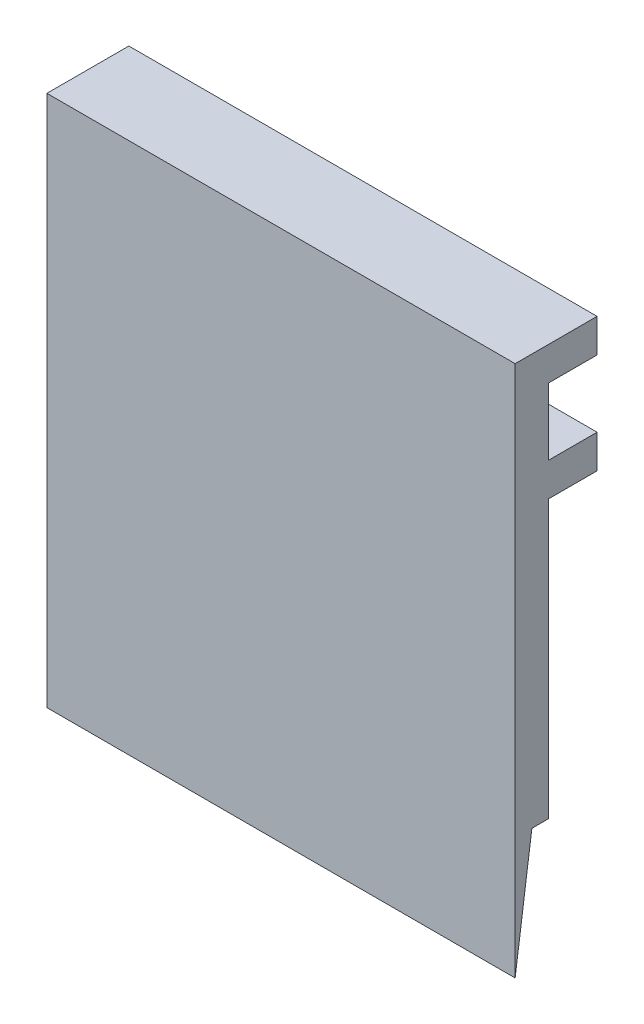
ISO-10303-21;
HEADER;
FILE_DESCRIPTION(('STEP AP214'),'2;1');
FILE_NAME('part.step','',(''),(''),'','','');
FILE_SCHEMA(('AUTOMOTIVE_DESIGN { 1 0 10303 214 1 1 1 1 }'));
ENDSEC;
DATA;
#1=APPLICATION_CONTEXT('core data for automotive mechanical design processes');
#2=APPLICATION_PROTOCOL_DEFINITION('international standard','automotive_design',2000,#1);
#3=PRODUCT_CONTEXT('',#1,'mechanical');
#4=PRODUCT('Part','Part','',(#3));
#5=PRODUCT_RELATED_PRODUCT_CATEGORY('part','',(#4));
#6=PRODUCT_DEFINITION_FORMATION('','',#4);
#7=PRODUCT_DEFINITION_CONTEXT('part definition',#1,'design');
#8=PRODUCT_DEFINITION('design','',#6,#7);
#9=PRODUCT_DEFINITION_SHAPE('','',#8);
#10=(LENGTH_UNIT() NAMED_UNIT(*) SI_UNIT(.MILLI.,.METRE.));
#11=(NAMED_UNIT(*) PLANE_ANGLE_UNIT() SI_UNIT($,.RADIAN.));
#12=(NAMED_UNIT(*) SI_UNIT($,.STERADIAN.) SOLID_ANGLE_UNIT());
#13=UNCERTAINTY_MEASURE_WITH_UNIT(LENGTH_MEASURE(1.E-05),#10,'distance_accuracy_value','');
#14=(GEOMETRIC_REPRESENTATION_CONTEXT(3) GLOBAL_UNCERTAINTY_ASSIGNED_CONTEXT((#13)) GLOBAL_UNIT_ASSIGNED_CONTEXT((#10,
#11,#12)) REPRESENTATION_CONTEXT('',''));
#15=CARTESIAN_POINT('',(0.,0.,0.));
#16=DIRECTION('',(0.,0.,1.));
#17=DIRECTION('',(1.,0.,0.));
#18=AXIS2_PLACEMENT_3D('',#15,#16,#17);
#19=CARTESIAN_POINT('',(0.,10.,-2.));
#20=DIRECTION('',(0.,0.,1.));
#21=DIRECTION('',(1.,0.,0.));
#22=AXIS2_PLACEMENT_3D('',#19,#20,#21);
#23=PLANE('',#22);
#24=DIRECTION('',(0.,-1.,0.));
#25=VECTOR('',#24,1.);
#26=CARTESIAN_POINT('',(27.99800038,10.,-2.));
#27=LINE('',#26,#25);
#28=CARTESIAN_POINT('',(27.99800038,30.81231465,-2.));
#29=VERTEX_POINT('',#28);
#30=CARTESIAN_POINT('',(27.99800038,26.81231465,-2.));
#31=VERTEX_POINT('',#30);
#32=EDGE_CURVE('E191',#29,#31,#27,.T.);
#33=ORIENTED_EDGE('',*,*,#32,.T.);
#34=DIRECTION('',(-1.,0.,0.));
#35=VECTOR('',#34,1.);
#36=CARTESIAN_POINT('',(0.,26.81231465,-2.));
#37=LINE('',#36,#35);
#38=CARTESIAN_POINT('',(0.,26.81231465,-2.));
#39=VERTEX_POINT('',#38);
#40=EDGE_CURVE('E11',#31,#39,#37,.T.);
#41=ORIENTED_EDGE('',*,*,#40,.T.);
#42=DIRECTION('',(0.,-1.,0.));
#43=VECTOR('',#42,1.);
#44=CARTESIAN_POINT('',(0.,10.,-2.));
#45=LINE('',#44,#43);
#46=CARTESIAN_POINT('',(0.,30.81231465,-2.));
#47=VERTEX_POINT('',#46);
#48=EDGE_CURVE('E189',#47,#39,#45,.T.);
#49=ORIENTED_EDGE('',*,*,#48,.F.);
#50=DIRECTION('',(1.,0.,0.));
#51=VECTOR('',#50,1.);
#52=CARTESIAN_POINT('',(0.,30.81231465,-2.));
#53=LINE('',#52,#51);
#54=EDGE_CURVE('E198',#47,#29,#53,.T.);
#55=ORIENTED_EDGE('',*,*,#54,.T.);
#56=EDGE_LOOP('',(#33,#41,#49,#55));
#57=FACE_BOUND('',#56,.T.);
#58=ADVANCED_FACE('F33',(#57),#23,.F.);
#59=CARTESIAN_POINT('',(0.,10.,0.));
#60=DIRECTION('',(1.,0.,0.));
#61=DIRECTION('',(0.,0.,-1.));
#62=AXIS2_PLACEMENT_3D('',#59,#60,#61);
#63=PLANE('',#62);
#64=DIRECTION('',(0.,-0.990621129243475,0.136637397137031));
#65=VECTOR('',#64,1.);
#66=CARTESIAN_POINT('',(0.,9.83197199533255,-1.21820303383898));
#67=LINE('',#66,#65);
#68=CARTESIAN_POINT('',(0.,8.24999999999998,-1.));
#69=VERTEX_POINT('',#68);
#70=CARTESIAN_POINT('',(0.,0.999999999999978,0.));
#71=VERTEX_POINT('',#70);
#72=EDGE_CURVE('E185',#69,#71,#67,.T.);
#73=ORIENTED_EDGE('',*,*,#72,.T.);
#74=DIRECTION('',(0.,-1.,0.));
#75=VECTOR('',#74,1.);
#76=CARTESIAN_POINT('',(0.,10.,0.));
#77=LINE('',#76,#75);
#78=CARTESIAN_POINT('',(0.,32.81231465,0.));
#79=VERTEX_POINT('',#78);
#80=EDGE_CURVE('E196',#79,#71,#77,.T.);
#81=ORIENTED_EDGE('',*,*,#80,.F.);
#82=DIRECTION('',(0.,0.,1.));
#83=VECTOR('',#82,1.);
#84=CARTESIAN_POINT('',(0.,32.81231465,0.));
#85=LINE('',#84,#83);
#86=CARTESIAN_POINT('',(0.,32.81231465,-4.9));
#87=VERTEX_POINT('',#86);
#88=EDGE_CURVE('E160',#87,#79,#85,.T.);
#89=ORIENTED_EDGE('',*,*,#88,.F.);
#90=DIRECTION('',(0.,-1.,0.));
#91=VECTOR('',#90,1.);
#92=CARTESIAN_POINT('',(0.,32.81231465,-4.9));
#93=LINE('',#92,#91);
#94=CARTESIAN_POINT('',(0.,30.81231465,-4.9));
#95=VERTEX_POINT('',#94);
#96=EDGE_CURVE('E147',#87,#95,#93,.T.);
#97=ORIENTED_EDGE('',*,*,#96,.T.);
#98=DIRECTION('',(0.,0.,1.));
#99=VECTOR('',#98,1.);
#100=CARTESIAN_POINT('',(0.,30.81231465,0.));
#101=LINE('',#100,#99);
#102=EDGE_CURVE('E55',#95,#47,#101,.T.);
#103=ORIENTED_EDGE('',*,*,#102,.T.);
#104=ORIENTED_EDGE('',*,*,#48,.T.);
#105=DIRECTION('',(0.,0.,-1.));
#106=VECTOR('',#105,1.);
#107=CARTESIAN_POINT('',(0.,26.81231465,0.));
#108=LINE('',#107,#106);
#109=CARTESIAN_POINT('',(0.,26.81231465,-4.9));
#110=VERTEX_POINT('',#109);
#111=EDGE_CURVE('E146',#39,#110,#108,.T.);
#112=ORIENTED_EDGE('',*,*,#111,.T.);
#113=DIRECTION('',(0.,-1.,0.));
#114=VECTOR('',#113,1.);
#115=CARTESIAN_POINT('',(0.,24.81231465,-4.9));
#116=LINE('',#115,#114);
#117=CARTESIAN_POINT('',(0.,24.81231465,-4.9));
#118=VERTEX_POINT('',#117);
#119=EDGE_CURVE('E142',#110,#118,#116,.T.);
#120=ORIENTED_EDGE('',*,*,#119,.T.);
#121=DIRECTION('',(0.,0.,1.));
#122=VECTOR('',#121,1.);
#123=CARTESIAN_POINT('',(0.,24.81231465,0.));
#124=LINE('',#123,#122);
#125=CARTESIAN_POINT('',(0.,24.81231465,-2.));
#126=VERTEX_POINT('',#125);
#127=EDGE_CURVE('E48',#118,#126,#124,.T.);
#128=ORIENTED_EDGE('',*,*,#127,.T.);
#129=CARTESIAN_POINT('',(0.,8.24999999999998,-2.));
#130=VERTEX_POINT('',#129);
#131=EDGE_CURVE('E188',#126,#130,#45,.T.);
#132=ORIENTED_EDGE('',*,*,#131,.T.);
#133=DIRECTION('',(0.,0.,1.));
#134=VECTOR('',#133,1.);
#135=CARTESIAN_POINT('',(0.,8.24999999999998,0.));
#136=LINE('',#135,#134);
#137=EDGE_CURVE('E177',#130,#69,#136,.T.);
#138=ORIENTED_EDGE('',*,*,#137,.T.);
#139=EDGE_LOOP('',(#73,#81,#89,#97,#103,#104,#112,#120,#128,#132,#138));
#140=FACE_BOUND('',#139,.T.);
#141=ADVANCED_FACE('F35',(#140),#63,.F.);
#142=CARTESIAN_POINT('',(0.,10.,0.));
#143=DIRECTION('',(0.,0.,-1.));
#144=DIRECTION('',(-1.,0.,0.));
#145=AXIS2_PLACEMENT_3D('',#142,#143,#144);
#146=PLANE('',#145);
#147=DIRECTION('',(1.,0.,0.));
#148=VECTOR('',#147,1.);
#149=CARTESIAN_POINT('',(-4.00199962000002,0.999999999999978,0.));
#150=LINE('',#149,#148);
#151=CARTESIAN_POINT('',(27.99800038,0.999999999999978,0.));
#152=VERTEX_POINT('',#151);
#153=EDGE_CURVE('E174',#71,#152,#150,.T.);
#154=ORIENTED_EDGE('',*,*,#153,.T.);
#155=DIRECTION('',(0.,-1.,0.));
#156=VECTOR('',#155,1.);
#157=CARTESIAN_POINT('',(27.99800038,10.,0.));
#158=LINE('',#157,#156);
#159=CARTESIAN_POINT('',(27.99800038,32.81231465,0.));
#160=VERTEX_POINT('',#159);
#161=EDGE_CURVE('E194',#160,#152,#158,.T.);
#162=ORIENTED_EDGE('',*,*,#161,.F.);
#163=DIRECTION('',(1.,0.,0.));
#164=VECTOR('',#163,1.);
#165=CARTESIAN_POINT('',(0.,32.81231465,0.));
#166=LINE('',#165,#164);
#167=EDGE_CURVE('E163',#79,#160,#166,.T.);
#168=ORIENTED_EDGE('',*,*,#167,.F.);
#169=ORIENTED_EDGE('',*,*,#80,.T.);
#170=EDGE_LOOP('',(#154,#162,#168,#169));
#171=FACE_BOUND('',#170,.T.);
#172=ADVANCED_FACE('F215',(#171),#146,.F.);
#173=CARTESIAN_POINT('',(27.99800038,10.,0.));
#174=DIRECTION('',(-1.,0.,0.));
#175=DIRECTION('',(0.,0.,1.));
#176=AXIS2_PLACEMENT_3D('',#173,#174,#175);
#177=PLANE('',#176);
#178=CARTESIAN_POINT('',(27.99800038,24.81231465,-2.));
#179=VERTEX_POINT('',#178);
#180=CARTESIAN_POINT('',(27.99800038,8.24999999999998,-2.));
#181=VERTEX_POINT('',#180);
#182=EDGE_CURVE('E124',#179,#181,#27,.T.);
#183=ORIENTED_EDGE('',*,*,#182,.F.);
#184=DIRECTION('',(0.,0.,-1.));
#185=VECTOR('',#184,1.);
#186=CARTESIAN_POINT('',(27.99800038,24.81231465,0.));
#187=LINE('',#186,#185);
#188=CARTESIAN_POINT('',(27.99800038,24.81231465,-4.9));
#189=VERTEX_POINT('',#188);
#190=EDGE_CURVE('E116',#179,#189,#187,.T.);
#191=ORIENTED_EDGE('',*,*,#190,.T.);
#192=DIRECTION('',(0.,1.,0.));
#193=VECTOR('',#192,1.);
#194=CARTESIAN_POINT('',(27.99800038,24.81231465,-4.9));
#195=LINE('',#194,#193);
#196=CARTESIAN_POINT('',(27.99800038,26.81231465,-4.9));
#197=VERTEX_POINT('',#196);
#198=EDGE_CURVE('E121',#189,#197,#195,.T.);
#199=ORIENTED_EDGE('',*,*,#198,.T.);
#200=DIRECTION('',(0.,0.,1.));
#201=VECTOR('',#200,1.);
#202=CARTESIAN_POINT('',(27.99800038,26.81231465,0.));
#203=LINE('',#202,#201);
#204=EDGE_CURVE('E134',#197,#31,#203,.T.);
#205=ORIENTED_EDGE('',*,*,#204,.T.);
#206=ORIENTED_EDGE('',*,*,#32,.F.);
#207=DIRECTION('',(0.,0.,-1.));
#208=VECTOR('',#207,1.);
#209=CARTESIAN_POINT('',(27.99800038,30.81231465,0.));
#210=LINE('',#209,#208);
#211=CARTESIAN_POINT('',(27.99800038,30.81231465,-4.9));
#212=VERTEX_POINT('',#211);
#213=EDGE_CURVE('E145',#29,#212,#210,.T.);
#214=ORIENTED_EDGE('',*,*,#213,.T.);
#215=DIRECTION('',(0.,1.,0.));
#216=VECTOR('',#215,1.);
#217=CARTESIAN_POINT('',(27.99800038,32.81231465,-4.9));
#218=LINE('',#217,#216);
#219=CARTESIAN_POINT('',(27.99800038,32.81231465,-4.9));
#220=VERTEX_POINT('',#219);
#221=EDGE_CURVE('E151',#212,#220,#218,.T.);
#222=ORIENTED_EDGE('',*,*,#221,.T.);
#223=DIRECTION('',(0.,0.,-1.));
#224=VECTOR('',#223,1.);
#225=CARTESIAN_POINT('',(27.99800038,32.81231465,0.));
#226=LINE('',#225,#224);
#227=EDGE_CURVE('E166',#160,#220,#226,.T.);
#228=ORIENTED_EDGE('',*,*,#227,.F.);
#229=ORIENTED_EDGE('',*,*,#161,.T.);
#230=DIRECTION('',(0.,-0.990621129243475,0.136637397137031));
#231=VECTOR('',#230,1.);
#232=CARTESIAN_POINT('',(27.99800038,0.999999999999978,0.));
#233=LINE('',#232,#231);
#234=CARTESIAN_POINT('',(27.99800038,8.24999999999998,-1.));
#235=VERTEX_POINT('',#234);
#236=EDGE_CURVE('E168',#235,#152,#233,.T.);
#237=ORIENTED_EDGE('',*,*,#236,.F.);
#238=DIRECTION('',(0.,0.,1.));
#239=VECTOR('',#238,1.);
#240=CARTESIAN_POINT('',(27.99800038,8.24999999999998,-1.));
#241=LINE('',#240,#239);
#242=EDGE_CURVE('E171',#181,#235,#241,.T.);
#243=ORIENTED_EDGE('',*,*,#242,.F.);
#244=EDGE_LOOP('',(#183,#191,#199,#205,#206,#214,#222,#228,#229,#237,#243));
#245=FACE_BOUND('',#244,.T.);
#246=ADVANCED_FACE('F118',(#245),#177,.F.);
#247=ORIENTED_EDGE('',*,*,#131,.F.);
#248=DIRECTION('',(1.,0.,0.));
#249=VECTOR('',#248,1.);
#250=CARTESIAN_POINT('',(0.,24.81231465,-2.));
#251=LINE('',#250,#249);
#252=EDGE_CURVE('E41',#126,#179,#251,.T.);
#253=ORIENTED_EDGE('',*,*,#252,.T.);
#254=ORIENTED_EDGE('',*,*,#182,.T.);
#255=DIRECTION('',(1.,0.,0.));
#256=VECTOR('',#255,1.);
#257=CARTESIAN_POINT('',(-4.00199962000002,8.24999999999998,-2.));
#258=LINE('',#257,#256);
#259=EDGE_CURVE('E178',#130,#181,#258,.T.);
#260=ORIENTED_EDGE('',*,*,#259,.F.);
#261=EDGE_LOOP('',(#247,#253,#254,#260));
#262=FACE_BOUND('',#261,.T.);
#263=ADVANCED_FACE('F202',(#262),#23,.F.);
#264=CARTESIAN_POINT('',(-4.00199962000002,0.999999999999978,0.));
#265=DIRECTION('',(0.,0.136637397137031,0.990621129243475));
#266=DIRECTION('',(0.,-0.990621129243475,0.136637397137031));
#267=AXIS2_PLACEMENT_3D('',#264,#265,#266);
#268=PLANE('',#267);
#269=DIRECTION('',(1.,0.,0.));
#270=VECTOR('',#269,1.);
#271=CARTESIAN_POINT('',(-4.00199962000002,8.24999999999998,-1.));
#272=LINE('',#271,#270);
#273=EDGE_CURVE('E175',#69,#235,#272,.T.);
#274=ORIENTED_EDGE('',*,*,#273,.T.);
#275=ORIENTED_EDGE('',*,*,#236,.T.);
#276=ORIENTED_EDGE('',*,*,#153,.F.);
#277=ORIENTED_EDGE('',*,*,#72,.F.);
#278=EDGE_LOOP('',(#274,#275,#276,#277));
#279=FACE_BOUND('',#278,.T.);
#280=ADVANCED_FACE('F210',(#279),#268,.F.);
#281=CARTESIAN_POINT('',(-4.00199962000002,8.24999999999998,-1.));
#282=DIRECTION('',(0.,1.,0.));
#283=DIRECTION('',(0.,0.,1.));
#284=AXIS2_PLACEMENT_3D('',#281,#282,#283);
#285=PLANE('',#284);
#286=ORIENTED_EDGE('',*,*,#259,.T.);
#287=ORIENTED_EDGE('',*,*,#242,.T.);
#288=ORIENTED_EDGE('',*,*,#273,.F.);
#289=ORIENTED_EDGE('',*,*,#137,.F.);
#290=EDGE_LOOP('',(#286,#287,#288,#289));
#291=FACE_BOUND('',#290,.T.);
#292=ADVANCED_FACE('F207',(#291),#285,.F.);
#293=CARTESIAN_POINT('',(0.,32.81231465,0.));
#294=DIRECTION('',(0.,-1.,0.));
#295=DIRECTION('',(0.,0.,-1.));
#296=AXIS2_PLACEMENT_3D('',#293,#294,#295);
#297=PLANE('',#296);
#298=ORIENTED_EDGE('',*,*,#88,.T.);
#299=ORIENTED_EDGE('',*,*,#167,.T.);
#300=ORIENTED_EDGE('',*,*,#227,.T.);
#301=DIRECTION('',(1.,0.,0.));
#302=VECTOR('',#301,1.);
#303=CARTESIAN_POINT('',(-5.29244744895969,32.81231465,-4.9));
#304=LINE('',#303,#302);
#305=EDGE_CURVE('E149',#87,#220,#304,.T.);
#306=ORIENTED_EDGE('',*,*,#305,.F.);
#307=EDGE_LOOP('',(#298,#299,#300,#306));
#308=FACE_BOUND('',#307,.T.);
#309=ADVANCED_FACE('F219',(#308),#297,.F.);
#310=CARTESIAN_POINT('',(-5.29244744895969,30.81231465,0.));
#311=DIRECTION('',(0.,-1.,0.));
#312=DIRECTION('',(0.,0.,-1.));
#313=AXIS2_PLACEMENT_3D('',#310,#311,#312);
#314=PLANE('',#313);
#315=ORIENTED_EDGE('',*,*,#54,.F.);
#316=ORIENTED_EDGE('',*,*,#102,.F.);
#317=DIRECTION('',(1.,0.,0.));
#318=VECTOR('',#317,1.);
#319=CARTESIAN_POINT('',(-5.29244744895969,30.81231465,-4.9));
#320=LINE('',#319,#318);
#321=EDGE_CURVE('E154',#95,#212,#320,.T.);
#322=ORIENTED_EDGE('',*,*,#321,.T.);
#323=ORIENTED_EDGE('',*,*,#213,.F.);
#324=EDGE_LOOP('',(#315,#316,#322,#323));
#325=FACE_BOUND('',#324,.T.);
#326=ADVANCED_FACE('F226',(#325),#314,.T.);
#327=CARTESIAN_POINT('',(-5.29244744895969,32.81231465,-4.9));
#328=DIRECTION('',(0.,0.,-1.));
#329=DIRECTION('',(-1.,0.,0.));
#330=AXIS2_PLACEMENT_3D('',#327,#328,#329);
#331=PLANE('',#330);
#332=ORIENTED_EDGE('',*,*,#96,.F.);
#333=ORIENTED_EDGE('',*,*,#305,.T.);
#334=ORIENTED_EDGE('',*,*,#221,.F.);
#335=ORIENTED_EDGE('',*,*,#321,.F.);
#336=EDGE_LOOP('',(#332,#333,#334,#335));
#337=FACE_BOUND('',#336,.T.);
#338=ADVANCED_FACE('F222',(#337),#331,.T.);
#339=CARTESIAN_POINT('',(-5.29244744895969,26.81231465,0.));
#340=DIRECTION('',(0.,1.,0.));
#341=DIRECTION('',(0.,0.,1.));
#342=AXIS2_PLACEMENT_3D('',#339,#340,#341);
#343=PLANE('',#342);
#344=ORIENTED_EDGE('',*,*,#40,.F.);
#345=ORIENTED_EDGE('',*,*,#204,.F.);
#346=DIRECTION('',(1.,0.,0.));
#347=VECTOR('',#346,1.);
#348=CARTESIAN_POINT('',(-5.29244744895969,26.81231465,-4.9));
#349=LINE('',#348,#347);
#350=EDGE_CURVE('E133',#110,#197,#349,.T.);
#351=ORIENTED_EDGE('',*,*,#350,.F.);
#352=ORIENTED_EDGE('',*,*,#111,.F.);
#353=EDGE_LOOP('',(#344,#345,#351,#352));
#354=FACE_BOUND('',#353,.T.);
#355=ADVANCED_FACE('F231',(#354),#343,.T.);
#356=CARTESIAN_POINT('',(-5.29244744895969,24.81231465,0.));
#357=DIRECTION('',(0.,-1.,0.));
#358=DIRECTION('',(0.,0.,-1.));
#359=AXIS2_PLACEMENT_3D('',#356,#357,#358);
#360=PLANE('',#359);
#361=ORIENTED_EDGE('',*,*,#252,.F.);
#362=ORIENTED_EDGE('',*,*,#127,.F.);
#363=DIRECTION('',(1.,0.,0.));
#364=VECTOR('',#363,1.);
#365=CARTESIAN_POINT('',(-5.29244744895969,24.81231465,-4.9));
#366=LINE('',#365,#364);
#367=EDGE_CURVE('E129',#118,#189,#366,.T.);
#368=ORIENTED_EDGE('',*,*,#367,.T.);
#369=ORIENTED_EDGE('',*,*,#190,.F.);
#370=EDGE_LOOP('',(#361,#362,#368,#369));
#371=FACE_BOUND('',#370,.T.);
#372=ADVANCED_FACE('F130',(#371),#360,.T.);
#373=CARTESIAN_POINT('',(-5.29244744895969,24.81231465,-4.9));
#374=DIRECTION('',(0.,0.,-1.));
#375=DIRECTION('',(-1.,0.,0.));
#376=AXIS2_PLACEMENT_3D('',#373,#374,#375);
#377=PLANE('',#376);
#378=ORIENTED_EDGE('',*,*,#119,.F.);
#379=ORIENTED_EDGE('',*,*,#350,.T.);
#380=ORIENTED_EDGE('',*,*,#198,.F.);
#381=ORIENTED_EDGE('',*,*,#367,.F.);
#382=EDGE_LOOP('',(#378,#379,#380,#381));
#383=FACE_BOUND('',#382,.T.);
#384=ADVANCED_FACE('F136',(#383),#377,.T.);
#385=CLOSED_SHELL('',(#58,#141,#172,#246,#263,#280,#292,#309,#326,#338,#355,#372,#384));
#386=MANIFOLD_SOLID_BREP('B2',#385);
#387=ADVANCED_BREP_SHAPE_REPRESENTATION('',(#18,#386),#14);
#388=SHAPE_DEFINITION_REPRESENTATION(#9,#387);
ENDSEC;
END-ISO-10303-21;
